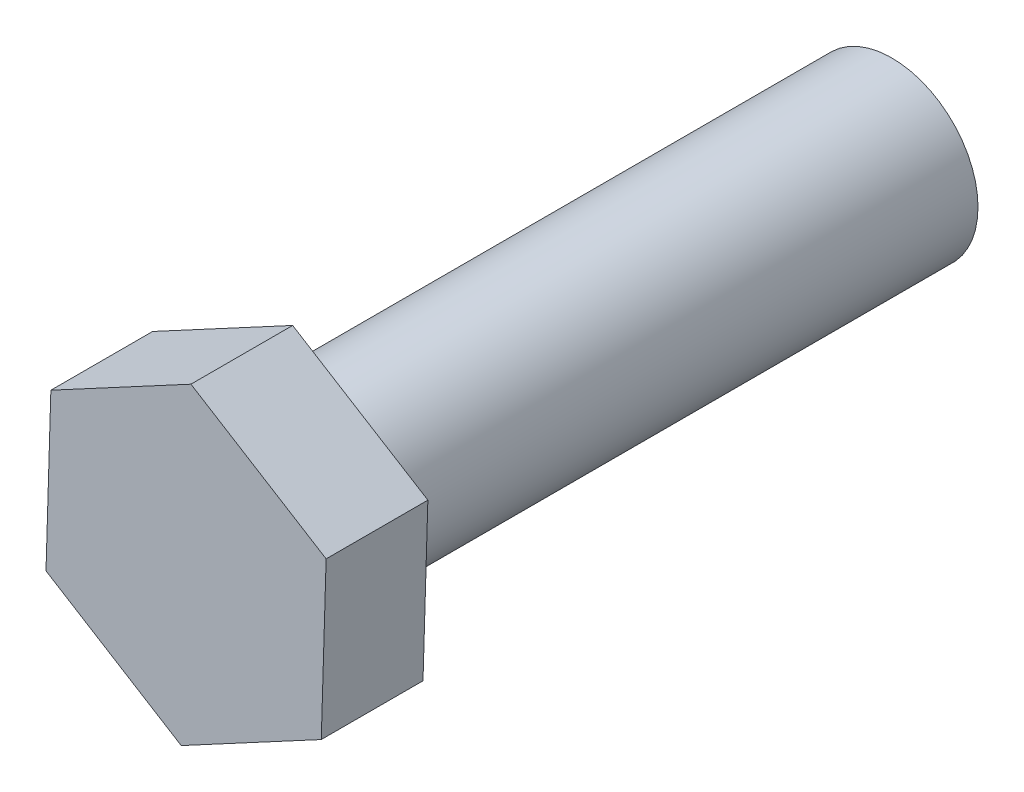
ISO-10303-21;
HEADER;
FILE_DESCRIPTION(('STEP AP214'),'2;1');
FILE_NAME('part.step','',(''),(''),'','','');
FILE_SCHEMA(('AUTOMOTIVE_DESIGN { 1 0 10303 214 1 1 1 1 }'));
ENDSEC;
DATA;
#1=APPLICATION_CONTEXT('core data for automotive mechanical design processes');
#2=APPLICATION_PROTOCOL_DEFINITION('international standard','automotive_design',2000,#1);
#3=PRODUCT_CONTEXT('',#1,'mechanical');
#4=PRODUCT('Part','Part','',(#3));
#5=PRODUCT_RELATED_PRODUCT_CATEGORY('part','',(#4));
#6=PRODUCT_DEFINITION_FORMATION('','',#4);
#7=PRODUCT_DEFINITION_CONTEXT('part definition',#1,'design');
#8=PRODUCT_DEFINITION('design','',#6,#7);
#9=PRODUCT_DEFINITION_SHAPE('','',#8);
#10=(LENGTH_UNIT() NAMED_UNIT(*) SI_UNIT(.MILLI.,.METRE.));
#11=(NAMED_UNIT(*) PLANE_ANGLE_UNIT() SI_UNIT($,.RADIAN.));
#12=(NAMED_UNIT(*) SI_UNIT($,.STERADIAN.) SOLID_ANGLE_UNIT());
#13=UNCERTAINTY_MEASURE_WITH_UNIT(LENGTH_MEASURE(1.E-05),#10,'distance_accuracy_value','');
#14=(GEOMETRIC_REPRESENTATION_CONTEXT(3) GLOBAL_UNCERTAINTY_ASSIGNED_CONTEXT((#13)) GLOBAL_UNIT_ASSIGNED_CONTEXT((#10,
#11,#12)) REPRESENTATION_CONTEXT('',''));
#15=CARTESIAN_POINT('',(0.,0.,0.));
#16=DIRECTION('',(0.,0.,1.));
#17=DIRECTION('',(1.,0.,0.));
#18=AXIS2_PLACEMENT_3D('',#15,#16,#17);
#19=CARTESIAN_POINT('',(-18.5301130390924,-0.269450567108481,-12.1));
#20=DIRECTION('',(0.999530911619697,-0.0306260790291301,0.));
#21=DIRECTION('',(0.,0.,-1.));
#22=AXIS2_PLACEMENT_3D('',#19,#20,#21);
#23=PLANE('',#22);
#24=DIRECTION('',(0.0306260790291301,0.999530911619697,0.));
#25=VECTOR('',#24,1.);
#26=CARTESIAN_POINT('',(-18.9043721472287,-12.4839931855626,38.6));
#27=LINE('',#26,#25);
#28=CARTESIAN_POINT('',(-18.6856803965458,-5.34663927499835,38.6));
#29=VERTEX_POINT('',#28);
#30=CARTESIAN_POINT('',(-18.374545681639,4.80773814078139,38.6));
#31=VERTEX_POINT('',#30);
#32=EDGE_CURVE('E264',#29,#31,#27,.T.);
#33=ORIENTED_EDGE('',*,*,#32,.T.);
#34=DIRECTION('',(0.,0.,1.));
#35=VECTOR('',#34,1.);
#36=CARTESIAN_POINT('',(-18.374545681639,4.80773814078139,-12.1));
#37=LINE('',#36,#35);
#38=CARTESIAN_POINT('',(-18.374545681639,4.80773814078139,45.1));
#39=VERTEX_POINT('',#38);
#40=EDGE_CURVE('E11',#31,#39,#37,.T.);
#41=ORIENTED_EDGE('',*,*,#40,.T.);
#42=DIRECTION('',(0.0306260790291301,0.999530911619697,0.));
#43=VECTOR('',#42,1.);
#44=CARTESIAN_POINT('',(-18.5301130390924,-0.269450567108481,45.1));
#45=LINE('',#44,#43);
#46=CARTESIAN_POINT('',(-18.6856803965458,-5.34663927499835,45.1));
#47=VERTEX_POINT('',#46);
#48=EDGE_CURVE('E99',#47,#39,#45,.T.);
#49=ORIENTED_EDGE('',*,*,#48,.F.);
#50=DIRECTION('',(0.,0.,1.));
#51=VECTOR('',#50,1.);
#52=CARTESIAN_POINT('',(-18.6856803965458,-5.34663927499835,-12.1));
#53=LINE('',#52,#51);
#54=EDGE_CURVE('E84',#29,#47,#53,.T.);
#55=ORIENTED_EDGE('',*,*,#54,.F.);
#56=EDGE_LOOP('',(#33,#41,#49,#55));
#57=FACE_BOUND('',#56,.T.);
#58=ADVANCED_FACE('F17',(#57),#23,.T.);
#59=CARTESIAN_POINT('',(-31.9543872777929,-7.48105777828057,-12.1));
#60=DIRECTION('',(-0.526288418267385,-0.850306121815911,0.));
#61=DIRECTION('',(-0.850306121815911,0.526288418267385,0.));
#62=AXIS2_PLACEMENT_3D('',#59,#60,#61);
#63=PLANE('',#62);
#64=DIRECTION('',(0.850306121815911,-0.526288418267385,0.));
#65=VECTOR('',#64,1.);
#66=CARTESIAN_POINT('',(-52.8620622664934,5.45953728171124,38.6));
#67=LINE('',#66,#65);
#68=CARTESIAN_POINT('',(-36.2735779999062,-4.8077381407814,38.6));
#69=VERTEX_POINT('',#68);
#70=CARTESIAN_POINT('',(-27.6351965556794,-10.1543774157797,38.6));
#71=VERTEX_POINT('',#70);
#72=EDGE_CURVE('E156',#69,#71,#67,.T.);
#73=ORIENTED_EDGE('',*,*,#72,.T.);
#74=DIRECTION('',(0.,0.,1.));
#75=VECTOR('',#74,1.);
#76=CARTESIAN_POINT('',(-27.6351965556794,-10.1543774157797,-12.1));
#77=LINE('',#76,#75);
#78=CARTESIAN_POINT('',(-27.6351965556794,-10.1543774157797,45.1));
#79=VERTEX_POINT('',#78);
#80=EDGE_CURVE('E95',#71,#79,#77,.T.);
#81=ORIENTED_EDGE('',*,*,#80,.T.);
#82=DIRECTION('',(0.850306121815911,-0.526288418267385,0.));
#83=VECTOR('',#82,1.);
#84=CARTESIAN_POINT('',(-31.9543872777929,-7.48105777828057,45.1));
#85=LINE('',#84,#83);
#86=CARTESIAN_POINT('',(-36.2735779999062,-4.8077381407814,45.1));
#87=VERTEX_POINT('',#86);
#88=EDGE_CURVE('E109',#87,#79,#85,.T.);
#89=ORIENTED_EDGE('',*,*,#88,.F.);
#90=DIRECTION('',(0.,0.,1.));
#91=VECTOR('',#90,1.);
#92=CARTESIAN_POINT('',(-36.2735779999062,-4.8077381407814,-12.1));
#93=LINE('',#92,#91);
#94=EDGE_CURVE('E40',#69,#87,#93,.T.);
#95=ORIENTED_EDGE('',*,*,#94,.F.);
#96=EDGE_LOOP('',(#73,#81,#89,#95));
#97=FACE_BOUND('',#96,.T.);
#98=ADVANCED_FACE('F179',(#97),#63,.T.);
#99=CARTESIAN_POINT('',(-31.4876852054327,7.75050834538906,-12.1));
#100=DIRECTION('',(-0.473242493352312,0.880932200845041,0.));
#101=DIRECTION('',(0.,0.,1.));
#102=AXIS2_PLACEMENT_3D('',#99,#100,#101);
#103=PLANE('',#102);
#104=DIRECTION('',(-0.880932200845041,-0.473242493352312,0.));
#105=VECTOR('',#104,1.);
#106=CARTESIAN_POINT('',(-63.9136405190804,-9.66892521288155,38.6));
#107=LINE('',#106,#105);
#108=CARTESIAN_POINT('',(-27.0129271258659,10.1543774157797,38.6));
#109=VERTEX_POINT('',#108);
#110=CARTESIAN_POINT('',(-35.9624432849995,5.34663927499836,38.6));
#111=VERTEX_POINT('',#110);
#112=EDGE_CURVE('E117',#109,#111,#107,.T.);
#113=ORIENTED_EDGE('',*,*,#112,.T.);
#114=DIRECTION('',(0.,0.,1.));
#115=VECTOR('',#114,1.);
#116=CARTESIAN_POINT('',(-35.9624432849995,5.34663927499836,-12.1));
#117=LINE('',#116,#115);
#118=CARTESIAN_POINT('',(-35.9624432849995,5.34663927499836,45.1));
#119=VERTEX_POINT('',#118);
#120=EDGE_CURVE('E131',#111,#119,#117,.T.);
#121=ORIENTED_EDGE('',*,*,#120,.T.);
#122=DIRECTION('',(-0.880932200845041,-0.473242493352312,0.));
#123=VECTOR('',#122,1.);
#124=CARTESIAN_POINT('',(-31.4876852054327,7.75050834538906,45.1));
#125=LINE('',#124,#123);
#126=CARTESIAN_POINT('',(-27.0129271258659,10.1543774157797,45.1));
#127=VERTEX_POINT('',#126);
#128=EDGE_CURVE('E124',#127,#119,#125,.T.);
#129=ORIENTED_EDGE('',*,*,#128,.F.);
#130=DIRECTION('',(0.,0.,1.));
#131=VECTOR('',#130,1.);
#132=CARTESIAN_POINT('',(-27.0129271258659,10.1543774157797,-12.1));
#133=LINE('',#132,#131);
#134=EDGE_CURVE('E21',#109,#127,#133,.T.);
#135=ORIENTED_EDGE('',*,*,#134,.F.);
#136=EDGE_LOOP('',(#113,#121,#129,#135));
#137=FACE_BOUND('',#136,.T.);
#138=ADVANCED_FACE('F19',(#137),#103,.T.);
#139=CARTESIAN_POINT('',(-22.6937364037525,7.48105777828058,-12.1));
#140=DIRECTION('',(0.526288418267385,0.850306121815911,0.));
#141=DIRECTION('',(0.,0.,-1.));
#142=AXIS2_PLACEMENT_3D('',#139,#140,#141);
#143=PLANE('',#142);
#144=DIRECTION('',(-0.850306121815911,0.526288418267385,0.));
#145=VECTOR('',#144,1.);
#146=CARTESIAN_POINT('',(-43.601411392453,20.4216528382724,38.6));
#147=LINE('',#146,#145);
#148=EDGE_CURVE('E111',#31,#109,#147,.T.);
#149=ORIENTED_EDGE('',*,*,#148,.T.);
#150=ORIENTED_EDGE('',*,*,#134,.T.);
#151=DIRECTION('',(-0.850306121815911,0.526288418267385,0.));
#152=VECTOR('',#151,1.);
#153=CARTESIAN_POINT('',(-22.6937364037525,7.48105777828058,45.1));
#154=LINE('',#153,#152);
#155=EDGE_CURVE('E104',#39,#127,#154,.T.);
#156=ORIENTED_EDGE('',*,*,#155,.F.);
#157=ORIENTED_EDGE('',*,*,#40,.F.);
#158=EDGE_LOOP('',(#149,#150,#156,#157));
#159=FACE_BOUND('',#158,.T.);
#160=ADVANCED_FACE('F141',(#159),#143,.T.);
#161=CARTESIAN_POINT('',(-36.1180106424529,0.269450567108484,-12.1));
#162=DIRECTION('',(-0.999530911619697,0.0306260790291308,0.));
#163=DIRECTION('',(0.,0.,1.));
#164=AXIS2_PLACEMENT_3D('',#161,#162,#163);
#165=PLANE('',#164);
#166=DIRECTION('',(-0.0306260790291308,-0.999530911619697,0.));
#167=VECTOR('',#166,1.);
#168=CARTESIAN_POINT('',(-36.4922697505892,-11.9450920513457,38.6));
#169=LINE('',#168,#167);
#170=EDGE_CURVE('E154',#111,#69,#169,.T.);
#171=ORIENTED_EDGE('',*,*,#170,.T.);
#172=ORIENTED_EDGE('',*,*,#94,.T.);
#173=DIRECTION('',(-0.0306260790291308,-0.999530911619696,0.));
#174=VECTOR('',#173,1.);
#175=CARTESIAN_POINT('',(-36.1180106424529,0.269450567108484,45.1));
#176=LINE('',#175,#174);
#177=EDGE_CURVE('E121',#119,#87,#176,.T.);
#178=ORIENTED_EDGE('',*,*,#177,.F.);
#179=ORIENTED_EDGE('',*,*,#120,.F.);
#180=EDGE_LOOP('',(#171,#172,#178,#179));
#181=FACE_BOUND('',#180,.T.);
#182=ADVANCED_FACE('F167',(#181),#165,.T.);
#183=CARTESIAN_POINT('',(-23.1604384761126,-7.75050834538906,-12.1));
#184=DIRECTION('',(0.473242493352311,-0.880932200845041,0.));
#185=DIRECTION('',(0.,0.,-1.));
#186=AXIS2_PLACEMENT_3D('',#183,#184,#185);
#187=PLANE('',#186);
#188=DIRECTION('',(0.880932200845041,0.473242493352311,0.));
#189=VECTOR('',#188,1.);
#190=CARTESIAN_POINT('',(-55.5863937897603,-25.1699419036596,38.6));
#191=LINE('',#190,#189);
#192=EDGE_CURVE('E90',#71,#29,#191,.T.);
#193=ORIENTED_EDGE('',*,*,#192,.T.);
#194=ORIENTED_EDGE('',*,*,#54,.T.);
#195=DIRECTION('',(0.880932200845041,0.473242493352311,0.));
#196=VECTOR('',#195,1.);
#197=CARTESIAN_POINT('',(-23.1604384761126,-7.75050834538906,45.1));
#198=LINE('',#197,#196);
#199=EDGE_CURVE('E88',#79,#47,#198,.T.);
#200=ORIENTED_EDGE('',*,*,#199,.F.);
#201=ORIENTED_EDGE('',*,*,#80,.F.);
#202=EDGE_LOOP('',(#193,#194,#200,#201));
#203=FACE_BOUND('',#202,.T.);
#204=ADVANCED_FACE('F86',(#203),#187,.T.);
#205=CARTESIAN_POINT('',(-63.1293214477623,-11.1289207444886,0.));
#206=DIRECTION('',(0.,0.,1.));
#207=DIRECTION('',(1.,0.,0.));
#208=AXIS2_PLACEMENT_3D('',#205,#206,#207);
#209=PLANE('',#208);
#210=CARTESIAN_POINT('',(-27.3240618407726,0.,0.));
#211=DIRECTION('',(0.,0.,1.));
#212=DIRECTION('',(1.,0.,0.));
#213=AXIS2_PLACEMENT_3D('',#210,#211,#212);
#214=CIRCLE('',#213,5.5);
#215=CARTESIAN_POINT('',(-21.8240618407726,0.,0.));
#216=VERTEX_POINT('',#215);
#217=EDGE_CURVE('E96',#216,#216,#214,.T.);
#218=ORIENTED_EDGE('',*,*,#217,.F.);
#219=EDGE_LOOP('',(#218));
#220=FACE_BOUND('',#219,.T.);
#221=ADVANCED_FACE('F175',(#220),#209,.F.);
#222=CARTESIAN_POINT('',(-27.3240618407726,0.,45.1));
#223=DIRECTION('',(0.,0.,-1.));
#224=DIRECTION('',(-1.,0.,0.));
#225=AXIS2_PLACEMENT_3D('',#222,#223,#224);
#226=CYLINDRICAL_SURFACE('',#225,5.5);
#227=CARTESIAN_POINT('',(-27.3240618407726,0.,38.6));
#228=DIRECTION('',(0.,0.,1.));
#229=DIRECTION('',(1.,0.,0.));
#230=AXIS2_PLACEMENT_3D('',#227,#228,#229);
#231=CIRCLE('',#230,5.5);
#232=CARTESIAN_POINT('',(-21.8240618407726,0.,38.6));
#233=VERTEX_POINT('',#232);
#234=EDGE_CURVE('E261',#233,#233,#231,.T.);
#235=ORIENTED_EDGE('',*,*,#234,.F.);
#236=EDGE_LOOP('',(#235));
#237=FACE_BOUND('',#236,.T.);
#238=ORIENTED_EDGE('',*,*,#217,.T.);
#239=EDGE_LOOP('',(#238));
#240=FACE_BOUND('',#239,.T.);
#241=ADVANCED_FACE('F188',(#237,#240),#226,.T.);
#242=CARTESIAN_POINT('',(-63.1293214477623,-11.1289207444886,45.1));
#243=DIRECTION('',(0.,0.,1.));
#244=DIRECTION('',(1.,0.,0.));
#245=AXIS2_PLACEMENT_3D('',#242,#243,#244);
#246=PLANE('',#245);
#247=ORIENTED_EDGE('',*,*,#199,.T.);
#248=ORIENTED_EDGE('',*,*,#48,.T.);
#249=ORIENTED_EDGE('',*,*,#155,.T.);
#250=ORIENTED_EDGE('',*,*,#128,.T.);
#251=ORIENTED_EDGE('',*,*,#177,.T.);
#252=ORIENTED_EDGE('',*,*,#88,.T.);
#253=EDGE_LOOP('',(#247,#248,#249,#250,#251,#252));
#254=FACE_BOUND('',#253,.T.);
#255=ADVANCED_FACE('F107',(#254),#246,.T.);
#256=CARTESIAN_POINT('',(-63.1293214477623,-11.1289207444886,38.6));
#257=DIRECTION('',(0.,0.,1.));
#258=DIRECTION('',(1.,0.,0.));
#259=AXIS2_PLACEMENT_3D('',#256,#257,#258);
#260=PLANE('',#259);
#261=ORIENTED_EDGE('',*,*,#32,.F.);
#262=ORIENTED_EDGE('',*,*,#192,.F.);
#263=ORIENTED_EDGE('',*,*,#72,.F.);
#264=ORIENTED_EDGE('',*,*,#170,.F.);
#265=ORIENTED_EDGE('',*,*,#112,.F.);
#266=ORIENTED_EDGE('',*,*,#148,.F.);
#267=EDGE_LOOP('',(#261,#262,#263,#264,#265,#266));
#268=FACE_BOUND('',#267,.T.);
#269=ORIENTED_EDGE('',*,*,#234,.T.);
#270=EDGE_LOOP('',(#269));
#271=FACE_BOUND('',#270,.T.);
#272=ADVANCED_FACE('F165',(#268,#271),#260,.F.);
#273=CLOSED_SHELL('',(#58,#98,#138,#160,#182,#204,#221,#241,#255,#272));
#274=MANIFOLD_SOLID_BREP('B1',#273);
#275=ADVANCED_BREP_SHAPE_REPRESENTATION('',(#18,#274),#14);
#276=SHAPE_DEFINITION_REPRESENTATION(#9,#275);
ENDSEC;
END-ISO-10303-21;
